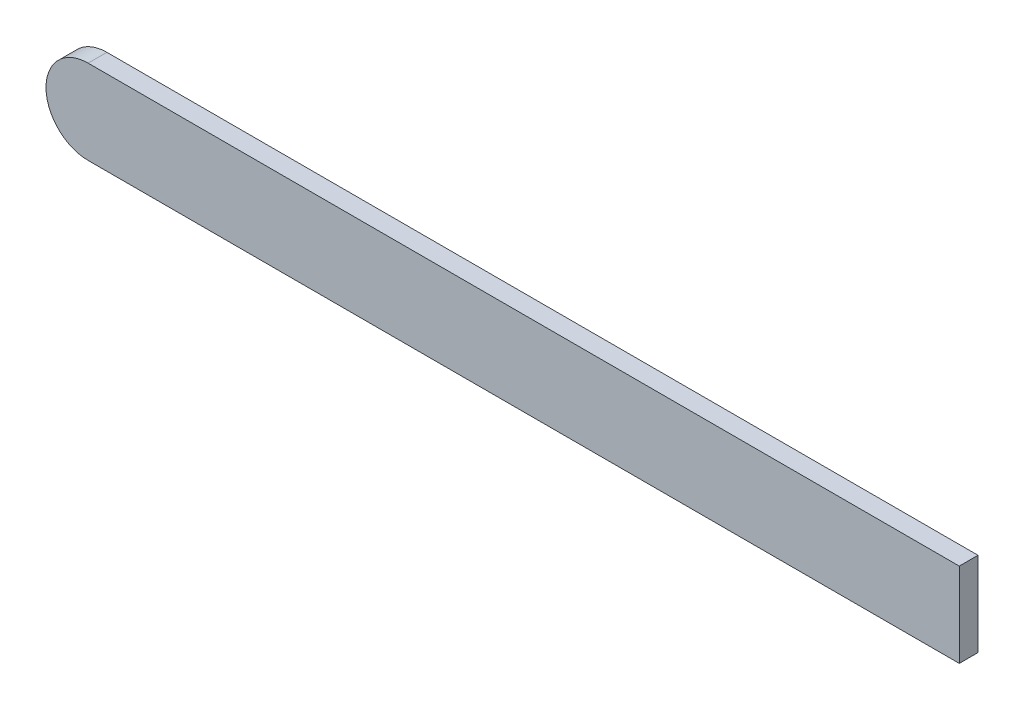
ISO-10303-21;
HEADER;
FILE_DESCRIPTION(('STEP AP214'),'2;1');
FILE_NAME('part.step','',(''),(''),'','','');
FILE_SCHEMA(('AUTOMOTIVE_DESIGN { 1 0 10303 214 1 1 1 1 }'));
ENDSEC;
DATA;
#1=APPLICATION_CONTEXT('core data for automotive mechanical design processes');
#2=APPLICATION_PROTOCOL_DEFINITION('international standard','automotive_design',2000,#1);
#3=PRODUCT_CONTEXT('',#1,'mechanical');
#4=PRODUCT('Part','Part','',(#3));
#5=PRODUCT_RELATED_PRODUCT_CATEGORY('part','',(#4));
#6=PRODUCT_DEFINITION_FORMATION('','',#4);
#7=PRODUCT_DEFINITION_CONTEXT('part definition',#1,'design');
#8=PRODUCT_DEFINITION('design','',#6,#7);
#9=PRODUCT_DEFINITION_SHAPE('','',#8);
#10=(LENGTH_UNIT() NAMED_UNIT(*) SI_UNIT(.MILLI.,.METRE.));
#11=(NAMED_UNIT(*) PLANE_ANGLE_UNIT() SI_UNIT($,.RADIAN.));
#12=(NAMED_UNIT(*) SI_UNIT($,.STERADIAN.) SOLID_ANGLE_UNIT());
#13=UNCERTAINTY_MEASURE_WITH_UNIT(LENGTH_MEASURE(1.E-05),#10,'distance_accuracy_value','');
#14=(GEOMETRIC_REPRESENTATION_CONTEXT(3) GLOBAL_UNCERTAINTY_ASSIGNED_CONTEXT((#13)) GLOBAL_UNIT_ASSIGNED_CONTEXT((#10,
#11,#12)) REPRESENTATION_CONTEXT('',''));
#15=CARTESIAN_POINT('',(0.,0.,0.));
#16=DIRECTION('',(0.,0.,1.));
#17=DIRECTION('',(1.,0.,0.));
#18=AXIS2_PLACEMENT_3D('',#15,#16,#17);
#19=CARTESIAN_POINT('',(-44.45,0.,2.11666666666582));
#20=DIRECTION('',(0.,0.,-1.));
#21=DIRECTION('',(-1.,0.,0.));
#22=AXIS2_PLACEMENT_3D('',#19,#20,#21);
#23=CYLINDRICAL_SURFACE('',#22,4.7625);
#24=CARTESIAN_POINT('',(-44.45,0.,0.));
#25=DIRECTION('',(0.,0.,1.));
#26=DIRECTION('',(1.,0.,0.));
#27=AXIS2_PLACEMENT_3D('',#24,#25,#26);
#28=CIRCLE('',#27,4.7625);
#29=CARTESIAN_POINT('',(-44.45,4.7625,0.));
#30=VERTEX_POINT('',#29);
#31=CARTESIAN_POINT('',(-44.45,-4.7625,0.));
#32=VERTEX_POINT('',#31);
#33=EDGE_CURVE('E109',#30,#32,#28,.T.);
#34=ORIENTED_EDGE('',*,*,#33,.T.);
#35=DIRECTION('',(0.,0.,-1.));
#36=VECTOR('',#35,1.);
#37=CARTESIAN_POINT('',(-44.45,-4.7625,2.11666666666582));
#38=LINE('',#37,#36);
#39=CARTESIAN_POINT('',(-44.45,-4.7625,2.11666666666582));
#40=VERTEX_POINT('',#39);
#41=EDGE_CURVE('E11',#40,#32,#38,.T.);
#42=ORIENTED_EDGE('',*,*,#41,.F.);
#43=CARTESIAN_POINT('',(-44.45,0.,2.11666666666582));
#44=DIRECTION('',(0.,0.,1.));
#45=DIRECTION('',(1.,0.,0.));
#46=AXIS2_PLACEMENT_3D('',#43,#44,#45);
#47=CIRCLE('',#46,4.7625);
#48=CARTESIAN_POINT('',(-44.45,4.7625,2.11666666666582));
#49=VERTEX_POINT('',#48);
#50=EDGE_CURVE('E93',#49,#40,#47,.T.);
#51=ORIENTED_EDGE('',*,*,#50,.F.);
#52=DIRECTION('',(0.,0.,-1.));
#53=VECTOR('',#52,1.);
#54=CARTESIAN_POINT('',(-44.45,4.7625,2.11666666666582));
#55=LINE('',#54,#53);
#56=EDGE_CURVE('E105',#49,#30,#55,.T.);
#57=ORIENTED_EDGE('',*,*,#56,.T.);
#58=EDGE_LOOP('',(#34,#42,#51,#57));
#59=FACE_BOUND('',#58,.T.);
#60=ADVANCED_FACE('F41',(#59),#23,.T.);
#61=CARTESIAN_POINT('',(-44.45,-4.7625,2.11666666666582));
#62=DIRECTION('',(0.,1.,0.));
#63=DIRECTION('',(0.,0.,1.));
#64=AXIS2_PLACEMENT_3D('',#61,#62,#63);
#65=PLANE('',#64);
#66=DIRECTION('',(1.,0.,0.));
#67=VECTOR('',#66,1.);
#68=CARTESIAN_POINT('',(-44.45,-4.7625,0.));
#69=LINE('',#68,#67);
#70=CARTESIAN_POINT('',(53.975,-4.7625,0.));
#71=VERTEX_POINT('',#70);
#72=EDGE_CURVE('E98',#32,#71,#69,.T.);
#73=ORIENTED_EDGE('',*,*,#72,.T.);
#74=DIRECTION('',(0.,0.,-1.));
#75=VECTOR('',#74,1.);
#76=CARTESIAN_POINT('',(53.975,-4.7625,2.11666666666582));
#77=LINE('',#76,#75);
#78=CARTESIAN_POINT('',(53.975,-4.7625,2.11666666666582));
#79=VERTEX_POINT('',#78);
#80=EDGE_CURVE('E50',#79,#71,#77,.T.);
#81=ORIENTED_EDGE('',*,*,#80,.F.);
#82=DIRECTION('',(1.,0.,0.));
#83=VECTOR('',#82,1.);
#84=CARTESIAN_POINT('',(-44.45,-4.7625,2.11666666666582));
#85=LINE('',#84,#83);
#86=EDGE_CURVE('E88',#40,#79,#85,.T.);
#87=ORIENTED_EDGE('',*,*,#86,.F.);
#88=ORIENTED_EDGE('',*,*,#41,.T.);
#89=EDGE_LOOP('',(#73,#81,#87,#88));
#90=FACE_BOUND('',#89,.T.);
#91=ADVANCED_FACE('F97',(#90),#65,.F.);
#92=CARTESIAN_POINT('',(53.975,4.7625,2.11666666666582));
#93=DIRECTION('',(-1.,0.,0.));
#94=DIRECTION('',(0.,0.,1.));
#95=AXIS2_PLACEMENT_3D('',#92,#93,#94);
#96=PLANE('',#95);
#97=DIRECTION('',(0.,1.,0.));
#98=VECTOR('',#97,1.);
#99=CARTESIAN_POINT('',(53.975,4.7625,0.));
#100=LINE('',#99,#98);
#101=CARTESIAN_POINT('',(53.975,4.7625,0.));
#102=VERTEX_POINT('',#101);
#103=EDGE_CURVE('E75',#71,#102,#100,.T.);
#104=ORIENTED_EDGE('',*,*,#103,.T.);
#105=DIRECTION('',(0.,0.,-1.));
#106=VECTOR('',#105,1.);
#107=CARTESIAN_POINT('',(53.975,4.7625,2.11666666666582));
#108=LINE('',#107,#106);
#109=CARTESIAN_POINT('',(53.975,4.7625,2.11666666666582));
#110=VERTEX_POINT('',#109);
#111=EDGE_CURVE('E100',#110,#102,#108,.T.);
#112=ORIENTED_EDGE('',*,*,#111,.F.);
#113=DIRECTION('',(0.,1.,0.));
#114=VECTOR('',#113,1.);
#115=CARTESIAN_POINT('',(53.975,4.7625,2.11666666666582));
#116=LINE('',#115,#114);
#117=EDGE_CURVE('E91',#79,#110,#116,.T.);
#118=ORIENTED_EDGE('',*,*,#117,.F.);
#119=ORIENTED_EDGE('',*,*,#80,.T.);
#120=EDGE_LOOP('',(#104,#112,#118,#119));
#121=FACE_BOUND('',#120,.T.);
#122=ADVANCED_FACE('F101',(#121),#96,.F.);
#123=CARTESIAN_POINT('',(-44.45,4.7625,2.11666666666582));
#124=DIRECTION('',(0.,-1.,0.));
#125=DIRECTION('',(0.,0.,-1.));
#126=AXIS2_PLACEMENT_3D('',#123,#124,#125);
#127=PLANE('',#126);
#128=DIRECTION('',(-1.,0.,0.));
#129=VECTOR('',#128,1.);
#130=CARTESIAN_POINT('',(-44.45,4.7625,0.));
#131=LINE('',#130,#129);
#132=EDGE_CURVE('E81',#102,#30,#131,.T.);
#133=ORIENTED_EDGE('',*,*,#132,.T.);
#134=ORIENTED_EDGE('',*,*,#56,.F.);
#135=DIRECTION('',(-1.,0.,0.));
#136=VECTOR('',#135,1.);
#137=CARTESIAN_POINT('',(-44.45,4.7625,2.11666666666582));
#138=LINE('',#137,#136);
#139=EDGE_CURVE('E58',#110,#49,#138,.T.);
#140=ORIENTED_EDGE('',*,*,#139,.F.);
#141=ORIENTED_EDGE('',*,*,#111,.T.);
#142=EDGE_LOOP('',(#133,#134,#140,#141));
#143=FACE_BOUND('',#142,.T.);
#144=ADVANCED_FACE('F122',(#143),#127,.F.);
#145=CARTESIAN_POINT('',(-44.45,0.,2.11666666666582));
#146=DIRECTION('',(0.,0.,1.));
#147=DIRECTION('',(1.,0.,0.));
#148=AXIS2_PLACEMENT_3D('',#145,#146,#147);
#149=PLANE('',#148);
#150=ORIENTED_EDGE('',*,*,#50,.T.);
#151=ORIENTED_EDGE('',*,*,#86,.T.);
#152=ORIENTED_EDGE('',*,*,#117,.T.);
#153=ORIENTED_EDGE('',*,*,#139,.T.);
#154=EDGE_LOOP('',(#150,#151,#152,#153));
#155=FACE_BOUND('',#154,.T.);
#156=ADVANCED_FACE('F89',(#155),#149,.T.);
#157=CARTESIAN_POINT('',(-44.45,0.,0.));
#158=DIRECTION('',(0.,0.,1.));
#159=DIRECTION('',(1.,0.,0.));
#160=AXIS2_PLACEMENT_3D('',#157,#158,#159);
#161=PLANE('',#160);
#162=ORIENTED_EDGE('',*,*,#33,.F.);
#163=ORIENTED_EDGE('',*,*,#132,.F.);
#164=ORIENTED_EDGE('',*,*,#103,.F.);
#165=ORIENTED_EDGE('',*,*,#72,.F.);
#166=EDGE_LOOP('',(#162,#163,#164,#165));
#167=FACE_BOUND('',#166,.T.);
#168=ADVANCED_FACE('F125',(#167),#161,.F.);
#169=CLOSED_SHELL('',(#60,#91,#122,#144,#156,#168));
#170=MANIFOLD_SOLID_BREP('B2',#169);
#171=ADVANCED_BREP_SHAPE_REPRESENTATION('',(#18,#170),#14);
#172=SHAPE_DEFINITION_REPRESENTATION(#9,#171);
ENDSEC;
END-ISO-10303-21;
